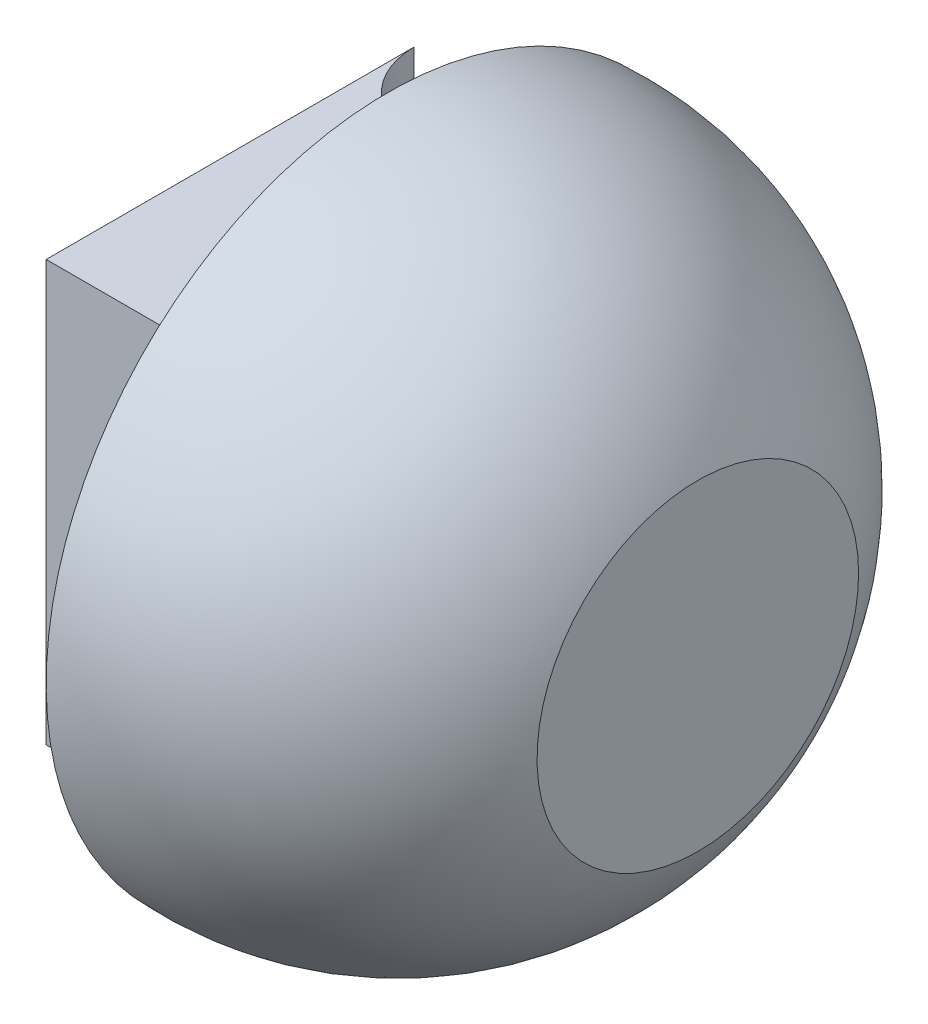
ISO-10303-21;
HEADER;
FILE_DESCRIPTION(('STEP AP214'),'2;1');
FILE_NAME('part.step','',(''),(''),'','','');
FILE_SCHEMA(('AUTOMOTIVE_DESIGN { 1 0 10303 214 1 1 1 1 }'));
ENDSEC;
DATA;
#1=APPLICATION_CONTEXT('core data for automotive mechanical design processes');
#2=APPLICATION_PROTOCOL_DEFINITION('international standard','automotive_design',2000,#1);
#3=PRODUCT_CONTEXT('',#1,'mechanical');
#4=PRODUCT('Part','Part','',(#3));
#5=PRODUCT_RELATED_PRODUCT_CATEGORY('part','',(#4));
#6=PRODUCT_DEFINITION_FORMATION('','',#4);
#7=PRODUCT_DEFINITION_CONTEXT('part definition',#1,'design');
#8=PRODUCT_DEFINITION('design','',#6,#7);
#9=PRODUCT_DEFINITION_SHAPE('','',#8);
#10=(LENGTH_UNIT() NAMED_UNIT(*) SI_UNIT(.MILLI.,.METRE.));
#11=(NAMED_UNIT(*) PLANE_ANGLE_UNIT() SI_UNIT($,.RADIAN.));
#12=(NAMED_UNIT(*) SI_UNIT($,.STERADIAN.) SOLID_ANGLE_UNIT());
#13=UNCERTAINTY_MEASURE_WITH_UNIT(LENGTH_MEASURE(1.E-05),#10,'distance_accuracy_value','');
#14=(GEOMETRIC_REPRESENTATION_CONTEXT(3) GLOBAL_UNCERTAINTY_ASSIGNED_CONTEXT((#13)) GLOBAL_UNIT_ASSIGNED_CONTEXT((#10,
#11,#12)) REPRESENTATION_CONTEXT('',''));
#15=CARTESIAN_POINT('',(0.,0.,0.));
#16=DIRECTION('',(0.,0.,1.));
#17=DIRECTION('',(1.,0.,0.));
#18=AXIS2_PLACEMENT_3D('',#15,#16,#17);
#19=CARTESIAN_POINT('',(45.7360469893337,0.,-19.84375));
#20=DIRECTION('',(-1.,0.,0.));
#21=DIRECTION('',(0.,-1.,0.));
#22=AXIS2_PLACEMENT_3D('',#19,#20,#21);
#23=DEGENERATE_TOROIDAL_SURFACE('',#22,0.401151653850622,9.92980932753755,.T.);
#24=CARTESIAN_POINT('',(45.24375,0.,-19.84375));
#25=DIRECTION('',(-1.,0.,0.));
#26=DIRECTION('',(0.,-1.,0.));
#27=AXIS2_PLACEMENT_3D('',#24,#25,#26);
#28=CIRCLE('',#27,10.31875);
#29=CARTESIAN_POINT('',(45.24375,-10.31875,-19.84375));
#30=VERTEX_POINT('',#29);
#31=EDGE_CURVE('E105',#30,#30,#28,.T.);
#32=ORIENTED_EDGE('',*,*,#31,.F.);
#33=EDGE_LOOP('',(#32));
#34=FACE_BOUND('',#33,.T.);
#35=CARTESIAN_POINT('',(54.61,0.,-19.84375));
#36=DIRECTION('',(1.,0.,0.));
#37=DIRECTION('',(0.,0.,-1.));
#38=AXIS2_PLACEMENT_3D('',#35,#36,#37);
#39=CIRCLE('',#38,4.8569424081094);
#40=CARTESIAN_POINT('',(54.61,0.,-24.7006924081094));
#41=VERTEX_POINT('',#40);
#42=EDGE_CURVE('E20',#41,#41,#39,.T.);
#43=ORIENTED_EDGE('',*,*,#42,.F.);
#44=EDGE_LOOP('',(#43));
#45=FACE_BOUND('',#44,.T.);
#46=ADVANCED_FACE('F16',(#34,#45),#23,.T.);
#47=CARTESIAN_POINT('',(42.8625,-6.35,-25.4));
#48=DIRECTION('',(0.,1.,0.));
#49=DIRECTION('',(-1.,0.,0.));
#50=AXIS2_PLACEMENT_3D('',#47,#48,#49);
#51=CYLINDRICAL_SURFACE('',#50,2.38125);
#52=CARTESIAN_POINT('',(42.8625,6.35,-25.4));
#53=DIRECTION('',(0.,1.,0.));
#54=DIRECTION('',(-1.,0.,0.));
#55=AXIS2_PLACEMENT_3D('',#52,#53,#54);
#56=CIRCLE('',#55,2.38125);
#57=CARTESIAN_POINT('',(40.48125,6.35,-25.4));
#58=VERTEX_POINT('',#57);
#59=CARTESIAN_POINT('',(45.24375,6.35,-25.4));
#60=VERTEX_POINT('',#59);
#61=EDGE_CURVE('E102',#58,#60,#56,.T.);
#62=ORIENTED_EDGE('',*,*,#61,.T.);
#63=DIRECTION('',(0.,1.,0.));
#64=VECTOR('',#63,1.);
#65=CARTESIAN_POINT('',(45.24375,-6.35,-25.4));
#66=LINE('',#65,#64);
#67=CARTESIAN_POINT('',(45.24375,-6.35,-25.4));
#68=VERTEX_POINT('',#67);
#69=EDGE_CURVE('E10',#68,#60,#66,.T.);
#70=ORIENTED_EDGE('',*,*,#69,.F.);
#71=CARTESIAN_POINT('',(42.8625,-6.35,-25.4));
#72=DIRECTION('',(0.,1.,0.));
#73=DIRECTION('',(-1.,0.,0.));
#74=AXIS2_PLACEMENT_3D('',#71,#72,#73);
#75=CIRCLE('',#74,2.38125);
#76=CARTESIAN_POINT('',(40.48125,-6.35,-25.4));
#77=VERTEX_POINT('',#76);
#78=EDGE_CURVE('E76',#77,#68,#75,.T.);
#79=ORIENTED_EDGE('',*,*,#78,.F.);
#80=DIRECTION('',(0.,1.,0.));
#81=VECTOR('',#80,1.);
#82=CARTESIAN_POINT('',(40.48125,-6.35,-25.4));
#83=LINE('',#82,#81);
#84=EDGE_CURVE('E111',#77,#58,#83,.T.);
#85=ORIENTED_EDGE('',*,*,#84,.T.);
#86=EDGE_LOOP('',(#62,#70,#79,#85));
#87=FACE_BOUND('',#86,.T.);
#88=ADVANCED_FACE('F18',(#87),#51,.F.);
#89=CARTESIAN_POINT('',(40.48125,-6.35,-14.2875));
#90=DIRECTION('',(0.,0.,-1.));
#91=DIRECTION('',(1.,0.,0.));
#92=AXIS2_PLACEMENT_3D('',#89,#90,#91);
#93=PLANE('',#92);
#94=DIRECTION('',(-1.,0.,0.));
#95=VECTOR('',#94,1.);
#96=CARTESIAN_POINT('',(40.48125,6.35,-14.2875));
#97=LINE('',#96,#95);
#98=CARTESIAN_POINT('',(45.24375,6.35,-14.2875));
#99=VERTEX_POINT('',#98);
#100=CARTESIAN_POINT('',(40.48125,6.35,-14.2875));
#101=VERTEX_POINT('',#100);
#102=EDGE_CURVE('E59',#99,#101,#97,.T.);
#103=ORIENTED_EDGE('',*,*,#102,.T.);
#104=DIRECTION('',(0.,1.,0.));
#105=VECTOR('',#104,1.);
#106=CARTESIAN_POINT('',(40.48125,-6.35,-14.2875));
#107=LINE('',#106,#105);
#108=CARTESIAN_POINT('',(40.48125,-6.35,-14.2875));
#109=VERTEX_POINT('',#108);
#110=EDGE_CURVE('E98',#109,#101,#107,.T.);
#111=ORIENTED_EDGE('',*,*,#110,.F.);
#112=DIRECTION('',(-1.,0.,0.));
#113=VECTOR('',#112,1.);
#114=CARTESIAN_POINT('',(40.48125,-6.35,-14.2875));
#115=LINE('',#114,#113);
#116=CARTESIAN_POINT('',(45.24375,-6.35,-14.2875));
#117=VERTEX_POINT('',#116);
#118=EDGE_CURVE('E94',#117,#109,#115,.T.);
#119=ORIENTED_EDGE('',*,*,#118,.F.);
#120=DIRECTION('',(0.,1.,0.));
#121=VECTOR('',#120,1.);
#122=CARTESIAN_POINT('',(45.24375,-6.35,-14.2875));
#123=LINE('',#122,#121);
#124=EDGE_CURVE('E27',#117,#99,#123,.T.);
#125=ORIENTED_EDGE('',*,*,#124,.T.);
#126=EDGE_LOOP('',(#103,#111,#119,#125));
#127=FACE_BOUND('',#126,.T.);
#128=ADVANCED_FACE('F93',(#127),#93,.F.);
#129=CARTESIAN_POINT('',(40.48125,-6.35,-25.4));
#130=DIRECTION('',(1.,0.,0.));
#131=DIRECTION('',(0.,1.,0.));
#132=AXIS2_PLACEMENT_3D('',#129,#130,#131);
#133=PLANE('',#132);
#134=DIRECTION('',(0.,0.,-1.));
#135=VECTOR('',#134,1.);
#136=CARTESIAN_POINT('',(40.48125,6.35,-25.4));
#137=LINE('',#136,#135);
#138=EDGE_CURVE('E67',#101,#58,#137,.T.);
#139=ORIENTED_EDGE('',*,*,#138,.T.);
#140=ORIENTED_EDGE('',*,*,#84,.F.);
#141=DIRECTION('',(0.,0.,-1.));
#142=VECTOR('',#141,1.);
#143=CARTESIAN_POINT('',(40.48125,-6.35,-25.4));
#144=LINE('',#143,#142);
#145=EDGE_CURVE('E40',#109,#77,#144,.T.);
#146=ORIENTED_EDGE('',*,*,#145,.F.);
#147=ORIENTED_EDGE('',*,*,#110,.T.);
#148=EDGE_LOOP('',(#139,#140,#146,#147));
#149=FACE_BOUND('',#148,.T.);
#150=ADVANCED_FACE('F116',(#149),#133,.F.);
#151=CARTESIAN_POINT('',(42.8625,-6.35,-25.4));
#152=DIRECTION('',(0.,1.,0.));
#153=DIRECTION('',(-1.,0.,0.));
#154=AXIS2_PLACEMENT_3D('',#151,#152,#153);
#155=PLANE('',#154);
#156=ORIENTED_EDGE('',*,*,#78,.T.);
#157=DIRECTION('',(0.,0.,1.));
#158=VECTOR('',#157,1.);
#159=CARTESIAN_POINT('',(45.24375,-6.35,-14.2875));
#160=LINE('',#159,#158);
#161=EDGE_CURVE('E119',#68,#117,#160,.T.);
#162=ORIENTED_EDGE('',*,*,#161,.T.);
#163=ORIENTED_EDGE('',*,*,#118,.T.);
#164=ORIENTED_EDGE('',*,*,#145,.T.);
#165=EDGE_LOOP('',(#156,#162,#163,#164));
#166=FACE_BOUND('',#165,.T.);
#167=ADVANCED_FACE('F150',(#166),#155,.F.);
#168=CARTESIAN_POINT('',(42.8625,6.35,-25.4));
#169=DIRECTION('',(0.,1.,0.));
#170=DIRECTION('',(-1.,0.,0.));
#171=AXIS2_PLACEMENT_3D('',#168,#169,#170);
#172=PLANE('',#171);
#173=ORIENTED_EDGE('',*,*,#61,.F.);
#174=ORIENTED_EDGE('',*,*,#138,.F.);
#175=ORIENTED_EDGE('',*,*,#102,.F.);
#176=DIRECTION('',(0.,0.,1.));
#177=VECTOR('',#176,1.);
#178=CARTESIAN_POINT('',(45.24375,6.35,-14.2875));
#179=LINE('',#178,#177);
#180=EDGE_CURVE('E87',#60,#99,#179,.T.);
#181=ORIENTED_EDGE('',*,*,#180,.F.);
#182=EDGE_LOOP('',(#173,#174,#175,#181));
#183=FACE_BOUND('',#182,.T.);
#184=ADVANCED_FACE('F85',(#183),#172,.T.);
#185=CARTESIAN_POINT('',(45.24375,0.,-9.525));
#186=DIRECTION('',(1.,0.,0.));
#187=DIRECTION('',(0.,1.,0.));
#188=AXIS2_PLACEMENT_3D('',#185,#186,#187);
#189=PLANE('',#188);
#190=ORIENTED_EDGE('',*,*,#31,.T.);
#191=EDGE_LOOP('',(#190));
#192=FACE_BOUND('',#191,.T.);
#193=ORIENTED_EDGE('',*,*,#124,.F.);
#194=ORIENTED_EDGE('',*,*,#161,.F.);
#195=ORIENTED_EDGE('',*,*,#69,.T.);
#196=ORIENTED_EDGE('',*,*,#180,.T.);
#197=EDGE_LOOP('',(#193,#194,#195,#196));
#198=FACE_BOUND('',#197,.T.);
#199=ADVANCED_FACE('F100',(#192,#198),#189,.F.);
#200=CARTESIAN_POINT('',(54.61,0.,-19.8348145931959));
#201=DIRECTION('',(1.,0.,0.));
#202=DIRECTION('',(0.,1.,0.));
#203=AXIS2_PLACEMENT_3D('',#200,#201,#202);
#204=PLANE('',#203);
#205=ORIENTED_EDGE('',*,*,#42,.T.);
#206=EDGE_LOOP('',(#205));
#207=FACE_BOUND('',#206,.T.);
#208=ADVANCED_FACE('F137',(#207),#204,.T.);
#209=CLOSED_SHELL('',(#46,#88,#128,#150,#167,#184,#199,#208));
#210=MANIFOLD_SOLID_BREP('B1',#209);
#211=ADVANCED_BREP_SHAPE_REPRESENTATION('',(#18,#210),#14);
#212=SHAPE_DEFINITION_REPRESENTATION(#9,#211);
ENDSEC;
END-ISO-10303-21;
